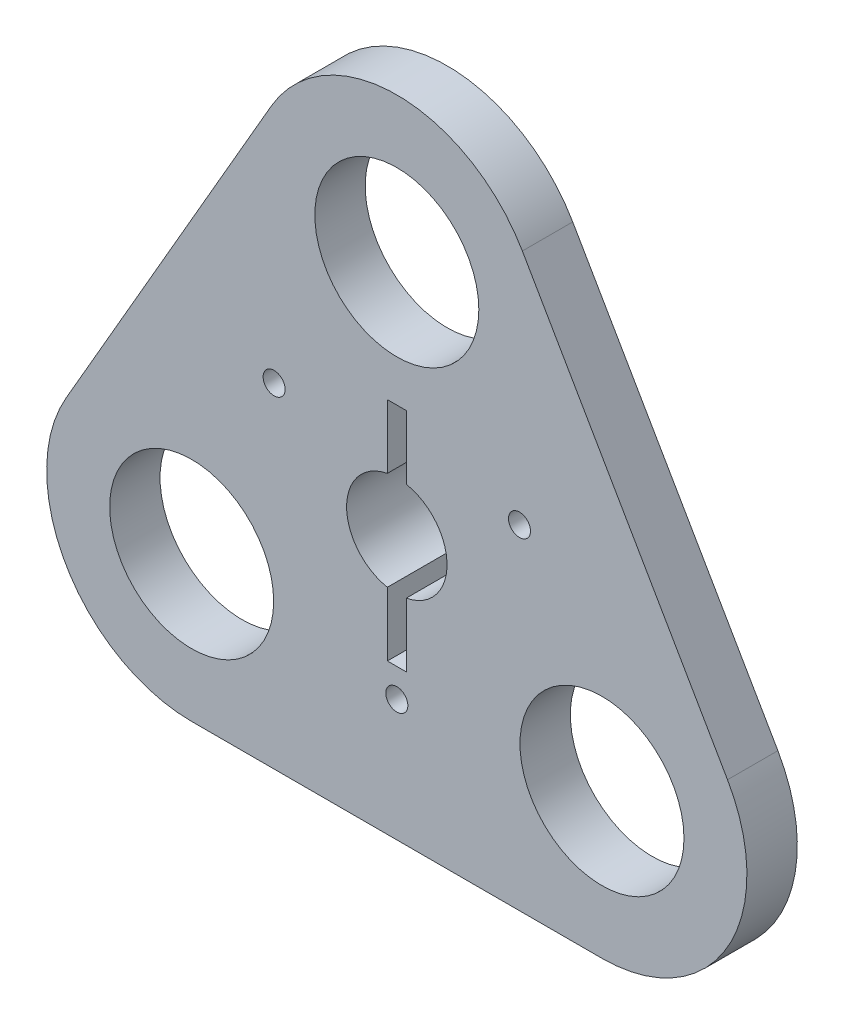
ISO-10303-21;
HEADER;
FILE_DESCRIPTION(('STEP AP214'),'2;1');
FILE_NAME('part.step','',(''),(''),'','','');
FILE_SCHEMA(('AUTOMOTIVE_DESIGN { 1 0 10303 214 1 1 1 1 }'));
ENDSEC;
DATA;
#1=APPLICATION_CONTEXT('core data for automotive mechanical design processes');
#2=APPLICATION_PROTOCOL_DEFINITION('international standard','automotive_design',2000,#1);
#3=PRODUCT_CONTEXT('',#1,'mechanical');
#4=PRODUCT('Part','Part','',(#3));
#5=PRODUCT_RELATED_PRODUCT_CATEGORY('part','',(#4));
#6=PRODUCT_DEFINITION_FORMATION('','',#4);
#7=PRODUCT_DEFINITION_CONTEXT('part definition',#1,'design');
#8=PRODUCT_DEFINITION('design','',#6,#7);
#9=PRODUCT_DEFINITION_SHAPE('','',#8);
#10=(LENGTH_UNIT() NAMED_UNIT(*) SI_UNIT(.MILLI.,.METRE.));
#11=(NAMED_UNIT(*) PLANE_ANGLE_UNIT() SI_UNIT($,.RADIAN.));
#12=(NAMED_UNIT(*) SI_UNIT($,.STERADIAN.) SOLID_ANGLE_UNIT());
#13=UNCERTAINTY_MEASURE_WITH_UNIT(LENGTH_MEASURE(1.E-05),#10,'distance_accuracy_value','');
#14=(GEOMETRIC_REPRESENTATION_CONTEXT(3) GLOBAL_UNCERTAINTY_ASSIGNED_CONTEXT((#13)) GLOBAL_UNIT_ASSIGNED_CONTEXT((#10,
#11,#12)) REPRESENTATION_CONTEXT('',''));
#15=CARTESIAN_POINT('',(0.,0.,0.));
#16=DIRECTION('',(0.,0.,1.));
#17=DIRECTION('',(1.,0.,0.));
#18=AXIS2_PLACEMENT_3D('',#15,#16,#17);
#19=CARTESIAN_POINT('',(0.,0.,4.));
#20=DIRECTION('',(0.,0.,-1.));
#21=DIRECTION('',(-1.,0.,0.));
#22=AXIS2_PLACEMENT_3D('',#19,#20,#21);
#23=CYLINDRICAL_SURFACE('',#22,7.975);
#24=CARTESIAN_POINT('',(0.,0.,4.));
#25=DIRECTION('',(0.,0.,1.));
#26=DIRECTION('',(1.,0.,0.));
#27=AXIS2_PLACEMENT_3D('',#24,#25,#26);
#28=CIRCLE('',#27,7.975);
#29=CARTESIAN_POINT('',(-1.5,7.83266397849416,4.));
#30=VERTEX_POINT('',#29);
#31=CARTESIAN_POINT('',(-1.5,-7.83266397849416,4.));
#32=VERTEX_POINT('',#31);
#33=EDGE_CURVE('E359',#30,#32,#28,.T.);
#34=ORIENTED_EDGE('',*,*,#33,.T.);
#35=DIRECTION('',(0.,0.,1.));
#36=VECTOR('',#35,1.);
#37=CARTESIAN_POINT('',(-1.5,-7.83266397849416,-8.));
#38=LINE('',#37,#36);
#39=CARTESIAN_POINT('',(-1.5,-7.83266397849416,-8.));
#40=VERTEX_POINT('',#39);
#41=EDGE_CURVE('E242',#40,#32,#38,.T.);
#42=ORIENTED_EDGE('',*,*,#41,.F.);
#43=CARTESIAN_POINT('',(0.,0.,-8.));
#44=DIRECTION('',(0.,0.,-1.));
#45=DIRECTION('',(-1.,0.,0.));
#46=AXIS2_PLACEMENT_3D('',#43,#44,#45);
#47=CIRCLE('',#46,7.975);
#48=CARTESIAN_POINT('',(-1.5,7.83266397849416,-8.));
#49=VERTEX_POINT('',#48);
#50=EDGE_CURVE('E226',#40,#49,#47,.T.);
#51=ORIENTED_EDGE('',*,*,#50,.T.);
#52=DIRECTION('',(0.,0.,1.));
#53=VECTOR('',#52,1.);
#54=CARTESIAN_POINT('',(-1.5,7.83266397849416,-8.));
#55=LINE('',#54,#53);
#56=EDGE_CURVE('E302',#49,#30,#55,.T.);
#57=ORIENTED_EDGE('',*,*,#56,.T.);
#58=EDGE_LOOP('',(#34,#42,#51,#57));
#59=FACE_BOUND('',#58,.T.);
#60=ADVANCED_FACE('F64',(#59),#23,.F.);
#61=CARTESIAN_POINT('',(1.5,7.83266397849416,-8.));
#62=VERTEX_POINT('',#61);
#63=CARTESIAN_POINT('',(1.5,-7.83266397849416,-8.));
#64=VERTEX_POINT('',#63);
#65=EDGE_CURVE('E310',#62,#64,#47,.T.);
#66=ORIENTED_EDGE('',*,*,#65,.T.);
#67=DIRECTION('',(0.,0.,1.));
#68=VECTOR('',#67,1.);
#69=CARTESIAN_POINT('',(1.5,-7.83266397849416,-8.));
#70=LINE('',#69,#68);
#71=CARTESIAN_POINT('',(1.5,-7.83266397849416,4.));
#72=VERTEX_POINT('',#71);
#73=EDGE_CURVE('E246',#64,#72,#70,.T.);
#74=ORIENTED_EDGE('',*,*,#73,.T.);
#75=CARTESIAN_POINT('',(1.5,7.83266397849416,4.));
#76=VERTEX_POINT('',#75);
#77=EDGE_CURVE('E358',#72,#76,#28,.T.);
#78=ORIENTED_EDGE('',*,*,#77,.T.);
#79=DIRECTION('',(0.,0.,1.));
#80=VECTOR('',#79,1.);
#81=CARTESIAN_POINT('',(1.5,7.83266397849416,-8.));
#82=LINE('',#81,#80);
#83=EDGE_CURVE('E297',#62,#76,#82,.T.);
#84=ORIENTED_EDGE('',*,*,#83,.F.);
#85=EDGE_LOOP('',(#66,#74,#78,#84));
#86=FACE_BOUND('',#85,.T.);
#87=ADVANCED_FACE('F487',(#86),#23,.F.);
#88=CARTESIAN_POINT('',(0.,0.,4.));
#89=DIRECTION('',(0.,0.,1.));
#90=DIRECTION('',(1.,0.,0.));
#91=AXIS2_PLACEMENT_3D('',#88,#89,#90);
#92=PLANE('',#91);
#93=CARTESIAN_POINT('',(19.4855715851499,11.25,4.));
#94=DIRECTION('',(0.,0.,1.));
#95=DIRECTION('',(-0.500000000000004,-0.866025403784436,0.));
#96=AXIS2_PLACEMENT_3D('',#93,#94,#95);
#97=CIRCLE('',#96,1.75);
#98=CARTESIAN_POINT('',(18.6105715851499,9.7344555433772,4.));
#99=VERTEX_POINT('',#98);
#100=EDGE_CURVE('E257',#99,#99,#97,.T.);
#101=ORIENTED_EDGE('',*,*,#100,.F.);
#102=EDGE_LOOP('',(#101));
#103=FACE_BOUND('',#102,.T.);
#104=CARTESIAN_POINT('',(-1.49186218934005E-13,-22.5,4.));
#105=DIRECTION('',(0.,0.,1.));
#106=DIRECTION('',(-0.499999999999992,0.866025403784443,0.));
#107=AXIS2_PLACEMENT_3D('',#104,#105,#106);
#108=CIRCLE('',#107,1.75);
#109=CARTESIAN_POINT('',(-0.875000000000135,-20.9844555433772,4.));
#110=VERTEX_POINT('',#109);
#111=EDGE_CURVE('E245',#110,#110,#108,.T.);
#112=ORIENTED_EDGE('',*,*,#111,.F.);
#113=EDGE_LOOP('',(#112));
#114=FACE_BOUND('',#113,.T.);
#115=CARTESIAN_POINT('',(-19.4855715851499,11.2499999999999,4.));
#116=DIRECTION('',(0.,0.,1.));
#117=DIRECTION('',(1.,0.,0.));
#118=AXIS2_PLACEMENT_3D('',#115,#116,#117);
#119=CIRCLE('',#118,1.75);
#120=CARTESIAN_POINT('',(-17.7355715851499,11.2499999999999,4.));
#121=VERTEX_POINT('',#120);
#122=EDGE_CURVE('E256',#121,#121,#119,.T.);
#123=ORIENTED_EDGE('',*,*,#122,.F.);
#124=EDGE_LOOP('',(#123));
#125=FACE_BOUND('',#124,.T.);
#126=CARTESIAN_POINT('',(0.,37.625,4.));
#127=DIRECTION('',(0.,0.,1.));
#128=DIRECTION('',(1.,0.,0.));
#129=AXIS2_PLACEMENT_3D('',#126,#127,#128);
#130=CIRCLE('',#129,13.025);
#131=CARTESIAN_POINT('',(13.025,37.625,4.));
#132=VERTEX_POINT('',#131);
#133=EDGE_CURVE('E334',#132,#132,#130,.T.);
#134=ORIENTED_EDGE('',*,*,#133,.F.);
#135=EDGE_LOOP('',(#134));
#136=FACE_BOUND('',#135,.T.);
#137=CARTESIAN_POINT('',(0.,37.625,4.));
#138=DIRECTION('',(0.,0.,1.));
#139=DIRECTION('',(1.,0.,0.));
#140=AXIS2_PLACEMENT_3D('',#137,#138,#139);
#141=CIRCLE('',#140,23.025);
#142=CARTESIAN_POINT('',(19.9402349221367,49.1375,4.));
#143=VERTEX_POINT('',#142);
#144=CARTESIAN_POINT('',(-19.9402349221367,49.1375,4.));
#145=VERTEX_POINT('',#144);
#146=EDGE_CURVE('E338',#143,#145,#141,.T.);
#147=ORIENTED_EDGE('',*,*,#146,.T.);
#148=DIRECTION('',(-0.499999999999998,-0.86602540378444,0.));
#149=VECTOR('',#148,1.);
#150=CARTESIAN_POINT('',(-36.2323378308314,20.9187499999999,4.));
#151=LINE('',#150,#149);
#152=CARTESIAN_POINT('',(-52.5244407395261,-7.30000000000021,4.));
#153=VERTEX_POINT('',#152);
#154=EDGE_CURVE('E343',#145,#153,#151,.T.);
#155=ORIENTED_EDGE('',*,*,#154,.T.);
#156=CARTESIAN_POINT('',(-32.5842058173894,-18.8125000000002,4.));
#157=DIRECTION('',(0.,0.,1.));
#158=DIRECTION('',(1.,0.,0.));
#159=AXIS2_PLACEMENT_3D('',#156,#157,#158);
#160=CIRCLE('',#159,23.025);
#161=CARTESIAN_POINT('',(-32.5842058173894,-41.8375000000002,4.));
#162=VERTEX_POINT('',#161);
#163=EDGE_CURVE('E346',#153,#162,#160,.T.);
#164=ORIENTED_EDGE('',*,*,#163,.T.);
#165=DIRECTION('',(1.,0.,0.));
#166=VECTOR('',#165,1.);
#167=CARTESIAN_POINT('',(0.,-41.8375000000002,4.));
#168=LINE('',#167,#166);
#169=CARTESIAN_POINT('',(32.5842058173894,-41.8375000000002,4.));
#170=VERTEX_POINT('',#169);
#171=EDGE_CURVE('E349',#162,#170,#168,.T.);
#172=ORIENTED_EDGE('',*,*,#171,.T.);
#173=CARTESIAN_POINT('',(32.5842058173894,-18.8125000000002,4.));
#174=DIRECTION('',(0.,0.,1.));
#175=DIRECTION('',(1.,0.,0.));
#176=AXIS2_PLACEMENT_3D('',#173,#174,#175);
#177=CIRCLE('',#176,23.025);
#178=CARTESIAN_POINT('',(52.5244407395262,-7.3000000000002,4.));
#179=VERTEX_POINT('',#178);
#180=EDGE_CURVE('E352',#170,#179,#177,.T.);
#181=ORIENTED_EDGE('',*,*,#180,.T.);
#182=DIRECTION('',(-0.499999999999998,0.86602540378444,0.));
#183=VECTOR('',#182,1.);
#184=CARTESIAN_POINT('',(36.2323378308314,20.9187499999999,4.));
#185=LINE('',#184,#183);
#186=EDGE_CURVE('E355',#179,#143,#185,.T.);
#187=ORIENTED_EDGE('',*,*,#186,.T.);
#188=EDGE_LOOP('',(#147,#155,#164,#172,#181,#187));
#189=FACE_BOUND('',#188,.T.);
#190=CARTESIAN_POINT('',(32.5842058173894,-18.8125000000002,4.));
#191=DIRECTION('',(0.,0.,1.));
#192=DIRECTION('',(1.,0.,0.));
#193=AXIS2_PLACEMENT_3D('',#190,#191,#192);
#194=CIRCLE('',#193,13.025);
#195=CARTESIAN_POINT('',(45.6092058173894,-18.8125000000002,4.));
#196=VERTEX_POINT('',#195);
#197=EDGE_CURVE('E363',#196,#196,#194,.T.);
#198=ORIENTED_EDGE('',*,*,#197,.F.);
#199=EDGE_LOOP('',(#198));
#200=FACE_BOUND('',#199,.T.);
#201=CARTESIAN_POINT('',(-32.5842058173894,-18.8125000000002,4.));
#202=DIRECTION('',(0.,0.,1.));
#203=DIRECTION('',(1.,0.,0.));
#204=AXIS2_PLACEMENT_3D('',#201,#202,#203);
#205=CIRCLE('',#204,13.025);
#206=CARTESIAN_POINT('',(-19.5592058173894,-18.8125000000002,4.));
#207=VERTEX_POINT('',#206);
#208=EDGE_CURVE('E367',#207,#207,#205,.T.);
#209=ORIENTED_EDGE('',*,*,#208,.F.);
#210=EDGE_LOOP('',(#209));
#211=FACE_BOUND('',#210,.T.);
#212=DIRECTION('',(-1.,0.,0.));
#213=VECTOR('',#212,1.);
#214=CARTESIAN_POINT('',(0.,-17.975,4.));
#215=LINE('',#214,#213);
#216=CARTESIAN_POINT('',(1.5,-17.975,4.));
#217=VERTEX_POINT('',#216);
#218=CARTESIAN_POINT('',(-1.5,-17.975,4.));
#219=VERTEX_POINT('',#218);
#220=EDGE_CURVE('E233',#217,#219,#215,.T.);
#221=ORIENTED_EDGE('',*,*,#220,.T.);
#222=DIRECTION('',(0.,1.,0.));
#223=VECTOR('',#222,1.);
#224=CARTESIAN_POINT('',(-1.5,0.,4.));
#225=LINE('',#224,#223);
#226=EDGE_CURVE('E219',#219,#32,#225,.T.);
#227=ORIENTED_EDGE('',*,*,#226,.T.);
#228=ORIENTED_EDGE('',*,*,#33,.F.);
#229=DIRECTION('',(0.,1.,0.));
#230=VECTOR('',#229,1.);
#231=CARTESIAN_POINT('',(-1.5,0.,4.));
#232=LINE('',#231,#230);
#233=CARTESIAN_POINT('',(-1.5,17.975,4.));
#234=VERTEX_POINT('',#233);
#235=EDGE_CURVE('E280',#30,#234,#232,.T.);
#236=ORIENTED_EDGE('',*,*,#235,.T.);
#237=DIRECTION('',(1.,0.,0.));
#238=VECTOR('',#237,1.);
#239=CARTESIAN_POINT('',(0.,17.975,4.));
#240=LINE('',#239,#238);
#241=CARTESIAN_POINT('',(1.5,17.975,4.));
#242=VERTEX_POINT('',#241);
#243=EDGE_CURVE('E290',#234,#242,#240,.T.);
#244=ORIENTED_EDGE('',*,*,#243,.T.);
#245=DIRECTION('',(0.,-1.,0.));
#246=VECTOR('',#245,1.);
#247=CARTESIAN_POINT('',(1.5,0.,4.));
#248=LINE('',#247,#246);
#249=EDGE_CURVE('E272',#242,#76,#248,.T.);
#250=ORIENTED_EDGE('',*,*,#249,.T.);
#251=ORIENTED_EDGE('',*,*,#77,.F.);
#252=DIRECTION('',(0.,-1.,0.));
#253=VECTOR('',#252,1.);
#254=CARTESIAN_POINT('',(1.5,0.,4.));
#255=LINE('',#254,#253);
#256=EDGE_CURVE('E228',#72,#217,#255,.T.);
#257=ORIENTED_EDGE('',*,*,#256,.T.);
#258=EDGE_LOOP('',(#221,#227,#228,#236,#244,#250,#251,#257));
#259=FACE_BOUND('',#258,.T.);
#260=ADVANCED_FACE('F483',(#103,#114,#125,#136,#189,#200,#211,#259),#92,.T.);
#261=CARTESIAN_POINT('',(19.4855715851499,11.25,-8.));
#262=DIRECTION('',(0.,0.,-1.));
#263=DIRECTION('',(-1.,0.,0.));
#264=AXIS2_PLACEMENT_3D('',#261,#262,#263);
#265=PLANE('',#264);
#266=CARTESIAN_POINT('',(19.4855715851499,11.25,-8.));
#267=DIRECTION('',(0.,0.,1.));
#268=DIRECTION('',(-0.500000000000004,-0.866025403784436,0.));
#269=AXIS2_PLACEMENT_3D('',#266,#267,#268);
#270=CIRCLE('',#269,1.75);
#271=CARTESIAN_POINT('',(18.6105715851499,9.7344555433772,-8.));
#272=VERTEX_POINT('',#271);
#273=EDGE_CURVE('E252',#272,#272,#270,.T.);
#274=ORIENTED_EDGE('',*,*,#273,.T.);
#275=EDGE_LOOP('',(#274));
#276=FACE_BOUND('',#275,.T.);
#277=CARTESIAN_POINT('',(-1.49186218934005E-13,-22.5,-8.));
#278=DIRECTION('',(0.,0.,1.));
#279=DIRECTION('',(-0.499999999999992,0.866025403784443,0.));
#280=AXIS2_PLACEMENT_3D('',#277,#278,#279);
#281=CIRCLE('',#280,1.75);
#282=CARTESIAN_POINT('',(-0.875000000000135,-20.9844555433772,-8.));
#283=VERTEX_POINT('',#282);
#284=EDGE_CURVE('E261',#283,#283,#281,.T.);
#285=ORIENTED_EDGE('',*,*,#284,.T.);
#286=EDGE_LOOP('',(#285));
#287=FACE_BOUND('',#286,.T.);
#288=CARTESIAN_POINT('',(-19.4855715851499,11.2499999999999,-8.));
#289=DIRECTION('',(0.,0.,1.));
#290=DIRECTION('',(1.,0.,0.));
#291=AXIS2_PLACEMENT_3D('',#288,#289,#290);
#292=CIRCLE('',#291,1.75);
#293=CARTESIAN_POINT('',(-17.7355715851499,11.2499999999999,-8.));
#294=VERTEX_POINT('',#293);
#295=EDGE_CURVE('E268',#294,#294,#292,.T.);
#296=ORIENTED_EDGE('',*,*,#295,.T.);
#297=EDGE_LOOP('',(#296));
#298=FACE_BOUND('',#297,.T.);
#299=CARTESIAN_POINT('',(19.4855715851499,11.25,-8.));
#300=DIRECTION('',(0.,0.,-1.));
#301=DIRECTION('',(-1.,0.,0.));
#302=AXIS2_PLACEMENT_3D('',#299,#300,#301);
#303=CIRCLE('',#302,6.75);
#304=CARTESIAN_POINT('',(19.4855715851499,18.,-8.));
#305=VERTEX_POINT('',#304);
#306=CARTESIAN_POINT('',(25.3312430606948,7.87499999999999,-8.));
#307=VERTEX_POINT('',#306);
#308=EDGE_CURVE('E314',#305,#307,#303,.T.);
#309=ORIENTED_EDGE('',*,*,#308,.T.);
#310=DIRECTION('',(-0.5,-0.866025403784439,0.));
#311=VECTOR('',#310,1.);
#312=CARTESIAN_POINT('',(5.84567147554496,-25.875,-8.));
#313=LINE('',#312,#311);
#314=CARTESIAN_POINT('',(5.84567147554496,-25.875,-8.));
#315=VERTEX_POINT('',#314);
#316=EDGE_CURVE('E317',#307,#315,#313,.T.);
#317=ORIENTED_EDGE('',*,*,#316,.T.);
#318=CARTESIAN_POINT('',(0.,-22.5,-8.));
#319=DIRECTION('',(0.,0.,-1.));
#320=DIRECTION('',(-1.,0.,0.));
#321=AXIS2_PLACEMENT_3D('',#318,#319,#320);
#322=CIRCLE('',#321,6.75);
#323=CARTESIAN_POINT('',(-5.84567147554496,-25.875,-8.));
#324=VERTEX_POINT('',#323);
#325=EDGE_CURVE('E320',#315,#324,#322,.T.);
#326=ORIENTED_EDGE('',*,*,#325,.T.);
#327=DIRECTION('',(-0.5,0.866025403784438,0.));
#328=VECTOR('',#327,1.);
#329=CARTESIAN_POINT('',(-25.3312430606948,7.87499999999999,-8.));
#330=LINE('',#329,#328);
#331=CARTESIAN_POINT('',(-25.3312430606948,7.87499999999999,-8.));
#332=VERTEX_POINT('',#331);
#333=EDGE_CURVE('E324',#324,#332,#330,.T.);
#334=ORIENTED_EDGE('',*,*,#333,.T.);
#335=CARTESIAN_POINT('',(-19.4855715851499,11.25,-8.));
#336=DIRECTION('',(0.,0.,-1.));
#337=DIRECTION('',(-1.,0.,0.));
#338=AXIS2_PLACEMENT_3D('',#335,#336,#337);
#339=CIRCLE('',#338,6.75);
#340=CARTESIAN_POINT('',(-19.4855715851499,18.,-8.));
#341=VERTEX_POINT('',#340);
#342=EDGE_CURVE('E327',#332,#341,#339,.T.);
#343=ORIENTED_EDGE('',*,*,#342,.T.);
#344=DIRECTION('',(1.,0.,0.));
#345=VECTOR('',#344,1.);
#346=CARTESIAN_POINT('',(19.4855715851499,18.,-8.));
#347=LINE('',#346,#345);
#348=EDGE_CURVE('E330',#341,#305,#347,.T.);
#349=ORIENTED_EDGE('',*,*,#348,.T.);
#350=EDGE_LOOP('',(#309,#317,#326,#334,#343,#349));
#351=FACE_BOUND('',#350,.T.);
#352=ORIENTED_EDGE('',*,*,#50,.F.);
#353=DIRECTION('',(0.,1.,0.));
#354=VECTOR('',#353,1.);
#355=CARTESIAN_POINT('',(-1.5,0.,-8.));
#356=LINE('',#355,#354);
#357=CARTESIAN_POINT('',(-1.5,-17.975,-8.));
#358=VERTEX_POINT('',#357);
#359=EDGE_CURVE('E213',#358,#40,#356,.T.);
#360=ORIENTED_EDGE('',*,*,#359,.F.);
#361=DIRECTION('',(-1.,0.,0.));
#362=VECTOR('',#361,1.);
#363=CARTESIAN_POINT('',(0.,-17.975,-8.));
#364=LINE('',#363,#362);
#365=CARTESIAN_POINT('',(1.5,-17.975,-8.));
#366=VERTEX_POINT('',#365);
#367=EDGE_CURVE('E203',#366,#358,#364,.T.);
#368=ORIENTED_EDGE('',*,*,#367,.F.);
#369=DIRECTION('',(0.,-1.,0.));
#370=VECTOR('',#369,1.);
#371=CARTESIAN_POINT('',(1.5,0.,-8.));
#372=LINE('',#371,#370);
#373=EDGE_CURVE('E212',#64,#366,#372,.T.);
#374=ORIENTED_EDGE('',*,*,#373,.F.);
#375=ORIENTED_EDGE('',*,*,#65,.F.);
#376=DIRECTION('',(0.,-1.,0.));
#377=VECTOR('',#376,1.);
#378=CARTESIAN_POINT('',(1.5,0.,-8.));
#379=LINE('',#378,#377);
#380=CARTESIAN_POINT('',(1.5,17.975,-8.));
#381=VERTEX_POINT('',#380);
#382=EDGE_CURVE('E276',#381,#62,#379,.T.);
#383=ORIENTED_EDGE('',*,*,#382,.F.);
#384=DIRECTION('',(1.,0.,0.));
#385=VECTOR('',#384,1.);
#386=CARTESIAN_POINT('',(0.,17.975,-8.));
#387=LINE('',#386,#385);
#388=CARTESIAN_POINT('',(-1.5,17.975,-8.));
#389=VERTEX_POINT('',#388);
#390=EDGE_CURVE('E279',#389,#381,#387,.T.);
#391=ORIENTED_EDGE('',*,*,#390,.F.);
#392=DIRECTION('',(0.,1.,0.));
#393=VECTOR('',#392,1.);
#394=CARTESIAN_POINT('',(-1.5,0.,-8.));
#395=LINE('',#394,#393);
#396=EDGE_CURVE('E283',#49,#389,#395,.T.);
#397=ORIENTED_EDGE('',*,*,#396,.F.);
#398=EDGE_LOOP('',(#352,#360,#368,#374,#375,#383,#391,#397));
#399=FACE_BOUND('',#398,.T.);
#400=ADVANCED_FACE('F224',(#276,#287,#298,#351,#399),#265,.T.);
#401=CARTESIAN_POINT('',(0.,0.,-4.));
#402=DIRECTION('',(0.,0.,1.));
#403=DIRECTION('',(1.,0.,0.));
#404=AXIS2_PLACEMENT_3D('',#401,#402,#403);
#405=PLANE('',#404);
#406=DIRECTION('',(0.5,-0.866025403784439,0.));
#407=VECTOR('',#406,1.);
#408=CARTESIAN_POINT('',(-9.3097730906827,-27.875,-4.));
#409=LINE('',#408,#407);
#410=CARTESIAN_POINT('',(-28.7953446758326,5.87499999999999,-4.));
#411=VERTEX_POINT('',#410);
#412=CARTESIAN_POINT('',(-9.3097730906827,-27.875,-4.));
#413=VERTEX_POINT('',#412);
#414=EDGE_CURVE('E75',#411,#413,#409,.T.);
#415=ORIENTED_EDGE('',*,*,#414,.T.);
#416=CARTESIAN_POINT('',(0.,-22.5,-4.));
#417=DIRECTION('',(0.,0.,1.));
#418=DIRECTION('',(1.,0.,0.));
#419=AXIS2_PLACEMENT_3D('',#416,#417,#418);
#420=CIRCLE('',#419,10.75);
#421=CARTESIAN_POINT('',(9.30977309068271,-27.875,-4.));
#422=VERTEX_POINT('',#421);
#423=EDGE_CURVE('E13',#413,#422,#420,.T.);
#424=ORIENTED_EDGE('',*,*,#423,.T.);
#425=DIRECTION('',(0.5,0.866025403784439,0.));
#426=VECTOR('',#425,1.);
#427=CARTESIAN_POINT('',(28.7953446758326,5.875,-4.));
#428=LINE('',#427,#426);
#429=CARTESIAN_POINT('',(28.7953446758326,5.875,-4.));
#430=VERTEX_POINT('',#429);
#431=EDGE_CURVE('E433',#422,#430,#428,.T.);
#432=ORIENTED_EDGE('',*,*,#431,.T.);
#433=CARTESIAN_POINT('',(19.4855715851499,11.25,-4.));
#434=DIRECTION('',(0.,0.,1.));
#435=DIRECTION('',(1.,0.,0.));
#436=AXIS2_PLACEMENT_3D('',#433,#434,#435);
#437=CIRCLE('',#436,10.75);
#438=CARTESIAN_POINT('',(19.4855715851499,22.,-4.));
#439=VERTEX_POINT('',#438);
#440=EDGE_CURVE('E427',#430,#439,#437,.T.);
#441=ORIENTED_EDGE('',*,*,#440,.T.);
#442=DIRECTION('',(-1.,0.,0.));
#443=VECTOR('',#442,1.);
#444=CARTESIAN_POINT('',(-19.4855715851499,22.,-4.));
#445=LINE('',#444,#443);
#446=CARTESIAN_POINT('',(-19.4855715851499,22.,-4.));
#447=VERTEX_POINT('',#446);
#448=EDGE_CURVE('E424',#439,#447,#445,.T.);
#449=ORIENTED_EDGE('',*,*,#448,.T.);
#450=CARTESIAN_POINT('',(-19.4855715851499,11.25,-4.));
#451=DIRECTION('',(0.,0.,1.));
#452=DIRECTION('',(1.,0.,0.));
#453=AXIS2_PLACEMENT_3D('',#450,#451,#452);
#454=CIRCLE('',#453,10.75);
#455=EDGE_CURVE('E430',#447,#411,#454,.T.);
#456=ORIENTED_EDGE('',*,*,#455,.T.);
#457=EDGE_LOOP('',(#415,#424,#432,#441,#449,#456));
#458=FACE_BOUND('',#457,.T.);
#459=CARTESIAN_POINT('',(-32.5842058173894,-18.8125000000002,-4.));
#460=DIRECTION('',(0.,0.,1.));
#461=DIRECTION('',(1.,0.,0.));
#462=AXIS2_PLACEMENT_3D('',#459,#460,#461);
#463=CIRCLE('',#462,13.025);
#464=CARTESIAN_POINT('',(-19.5592058173894,-18.8125000000002,-4.));
#465=VERTEX_POINT('',#464);
#466=EDGE_CURVE('E339',#465,#465,#463,.T.);
#467=ORIENTED_EDGE('',*,*,#466,.T.);
#468=EDGE_LOOP('',(#467));
#469=FACE_BOUND('',#468,.T.);
#470=CARTESIAN_POINT('',(32.5842058173894,-18.8125000000002,-4.));
#471=DIRECTION('',(0.,0.,1.));
#472=DIRECTION('',(1.,0.,0.));
#473=AXIS2_PLACEMENT_3D('',#470,#471,#472);
#474=CIRCLE('',#473,13.025);
#475=CARTESIAN_POINT('',(45.6092058173894,-18.8125000000002,-4.));
#476=VERTEX_POINT('',#475);
#477=EDGE_CURVE('E394',#476,#476,#474,.T.);
#478=ORIENTED_EDGE('',*,*,#477,.T.);
#479=EDGE_LOOP('',(#478));
#480=FACE_BOUND('',#479,.T.);
#481=CARTESIAN_POINT('',(0.,37.625,-4.));
#482=DIRECTION('',(0.,0.,1.));
#483=DIRECTION('',(1.,0.,0.));
#484=AXIS2_PLACEMENT_3D('',#481,#482,#483);
#485=CIRCLE('',#484,23.025);
#486=CARTESIAN_POINT('',(19.9402349221367,49.1375,-4.));
#487=VERTEX_POINT('',#486);
#488=CARTESIAN_POINT('',(-19.9402349221367,49.1375,-4.));
#489=VERTEX_POINT('',#488);
#490=EDGE_CURVE('E375',#487,#489,#485,.T.);
#491=ORIENTED_EDGE('',*,*,#490,.F.);
#492=DIRECTION('',(-0.499999999999998,0.86602540378444,0.));
#493=VECTOR('',#492,1.);
#494=CARTESIAN_POINT('',(36.2323378308314,20.9187499999999,-4.));
#495=LINE('',#494,#493);
#496=CARTESIAN_POINT('',(52.5244407395262,-7.3000000000002,-4.));
#497=VERTEX_POINT('',#496);
#498=EDGE_CURVE('E391',#497,#487,#495,.T.);
#499=ORIENTED_EDGE('',*,*,#498,.F.);
#500=CARTESIAN_POINT('',(32.5842058173894,-18.8125000000002,-4.));
#501=DIRECTION('',(0.,0.,1.));
#502=DIRECTION('',(1.,0.,0.));
#503=AXIS2_PLACEMENT_3D('',#500,#501,#502);
#504=CIRCLE('',#503,23.025);
#505=CARTESIAN_POINT('',(32.5842058173894,-41.8375000000002,-4.));
#506=VERTEX_POINT('',#505);
#507=EDGE_CURVE('E388',#506,#497,#504,.T.);
#508=ORIENTED_EDGE('',*,*,#507,.F.);
#509=DIRECTION('',(1.,0.,0.));
#510=VECTOR('',#509,1.);
#511=CARTESIAN_POINT('',(0.,-41.8375000000002,-4.));
#512=LINE('',#511,#510);
#513=CARTESIAN_POINT('',(-32.5842058173894,-41.8375000000002,-4.));
#514=VERTEX_POINT('',#513);
#515=EDGE_CURVE('E385',#514,#506,#512,.T.);
#516=ORIENTED_EDGE('',*,*,#515,.F.);
#517=CARTESIAN_POINT('',(-32.5842058173894,-18.8125000000002,-4.));
#518=DIRECTION('',(0.,0.,1.));
#519=DIRECTION('',(1.,0.,0.));
#520=AXIS2_PLACEMENT_3D('',#517,#518,#519);
#521=CIRCLE('',#520,23.025);
#522=CARTESIAN_POINT('',(-52.5244407395261,-7.30000000000021,-4.));
#523=VERTEX_POINT('',#522);
#524=EDGE_CURVE('E382',#523,#514,#521,.T.);
#525=ORIENTED_EDGE('',*,*,#524,.F.);
#526=DIRECTION('',(-0.499999999999998,-0.86602540378444,0.));
#527=VECTOR('',#526,1.);
#528=CARTESIAN_POINT('',(-36.2323378308314,20.9187499999999,-4.));
#529=LINE('',#528,#527);
#530=EDGE_CURVE('E379',#489,#523,#529,.T.);
#531=ORIENTED_EDGE('',*,*,#530,.F.);
#532=EDGE_LOOP('',(#491,#499,#508,#516,#525,#531));
#533=FACE_BOUND('',#532,.T.);
#534=CARTESIAN_POINT('',(0.,37.625,-4.));
#535=DIRECTION('',(0.,0.,1.));
#536=DIRECTION('',(1.,0.,0.));
#537=AXIS2_PLACEMENT_3D('',#534,#535,#536);
#538=CIRCLE('',#537,13.025);
#539=CARTESIAN_POINT('',(13.025,37.625,-4.));
#540=VERTEX_POINT('',#539);
#541=EDGE_CURVE('E333',#540,#540,#538,.T.);
#542=ORIENTED_EDGE('',*,*,#541,.T.);
#543=EDGE_LOOP('',(#542));
#544=FACE_BOUND('',#543,.T.);
#545=ADVANCED_FACE('F665',(#458,#469,#480,#533,#544),#405,.F.);
#546=CARTESIAN_POINT('',(0.,37.625,4.));
#547=DIRECTION('',(0.,0.,-1.));
#548=DIRECTION('',(-1.,0.,0.));
#549=AXIS2_PLACEMENT_3D('',#546,#547,#548);
#550=CYLINDRICAL_SURFACE('',#549,23.025);
#551=ORIENTED_EDGE('',*,*,#490,.T.);
#552=DIRECTION('',(0.,0.,-1.));
#553=VECTOR('',#552,1.);
#554=CARTESIAN_POINT('',(-19.9402349221367,49.1375,4.));
#555=LINE('',#554,#553);
#556=EDGE_CURVE('E420',#145,#489,#555,.T.);
#557=ORIENTED_EDGE('',*,*,#556,.F.);
#558=ORIENTED_EDGE('',*,*,#146,.F.);
#559=DIRECTION('',(0.,0.,-1.));
#560=VECTOR('',#559,1.);
#561=CARTESIAN_POINT('',(19.9402349221367,49.1375,4.));
#562=LINE('',#561,#560);
#563=EDGE_CURVE('E371',#143,#487,#562,.T.);
#564=ORIENTED_EDGE('',*,*,#563,.T.);
#565=EDGE_LOOP('',(#551,#557,#558,#564));
#566=FACE_BOUND('',#565,.T.);
#567=ADVANCED_FACE('F661',(#566),#550,.T.);
#568=CARTESIAN_POINT('',(-36.2323378308314,20.9187499999999,4.));
#569=DIRECTION('',(0.86602540378444,-0.499999999999998,0.));
#570=DIRECTION('',(0.499999999999998,0.86602540378444,0.));
#571=AXIS2_PLACEMENT_3D('',#568,#569,#570);
#572=PLANE('',#571);
#573=ORIENTED_EDGE('',*,*,#530,.T.);
#574=DIRECTION('',(0.,0.,-1.));
#575=VECTOR('',#574,1.);
#576=CARTESIAN_POINT('',(-52.5244407395261,-7.30000000000021,4.));
#577=LINE('',#576,#575);
#578=EDGE_CURVE('E416',#153,#523,#577,.T.);
#579=ORIENTED_EDGE('',*,*,#578,.F.);
#580=ORIENTED_EDGE('',*,*,#154,.F.);
#581=ORIENTED_EDGE('',*,*,#556,.T.);
#582=EDGE_LOOP('',(#573,#579,#580,#581));
#583=FACE_BOUND('',#582,.T.);
#584=ADVANCED_FACE('F657',(#583),#572,.F.);
#585=CARTESIAN_POINT('',(-32.5842058173894,-18.8125000000002,4.));
#586=DIRECTION('',(0.,0.,-1.));
#587=DIRECTION('',(-1.,0.,0.));
#588=AXIS2_PLACEMENT_3D('',#585,#586,#587);
#589=CYLINDRICAL_SURFACE('',#588,23.025);
#590=ORIENTED_EDGE('',*,*,#524,.T.);
#591=DIRECTION('',(0.,0.,-1.));
#592=VECTOR('',#591,1.);
#593=CARTESIAN_POINT('',(-32.5842058173894,-41.8375000000002,4.));
#594=LINE('',#593,#592);
#595=EDGE_CURVE('E412',#162,#514,#594,.T.);
#596=ORIENTED_EDGE('',*,*,#595,.F.);
#597=ORIENTED_EDGE('',*,*,#163,.F.);
#598=ORIENTED_EDGE('',*,*,#578,.T.);
#599=EDGE_LOOP('',(#590,#596,#597,#598));
#600=FACE_BOUND('',#599,.T.);
#601=ADVANCED_FACE('F653',(#600),#589,.T.);
#602=CARTESIAN_POINT('',(0.,-41.8375000000002,4.));
#603=DIRECTION('',(0.,1.,0.));
#604=DIRECTION('',(0.,0.,1.));
#605=AXIS2_PLACEMENT_3D('',#602,#603,#604);
#606=PLANE('',#605);
#607=ORIENTED_EDGE('',*,*,#515,.T.);
#608=DIRECTION('',(0.,0.,-1.));
#609=VECTOR('',#608,1.);
#610=CARTESIAN_POINT('',(32.5842058173894,-41.8375000000002,4.));
#611=LINE('',#610,#609);
#612=EDGE_CURVE('E408',#170,#506,#611,.T.);
#613=ORIENTED_EDGE('',*,*,#612,.F.);
#614=ORIENTED_EDGE('',*,*,#171,.F.);
#615=ORIENTED_EDGE('',*,*,#595,.T.);
#616=EDGE_LOOP('',(#607,#613,#614,#615));
#617=FACE_BOUND('',#616,.T.);
#618=ADVANCED_FACE('F649',(#617),#606,.F.);
#619=CARTESIAN_POINT('',(32.5842058173894,-18.8125000000002,4.));
#620=DIRECTION('',(0.,0.,-1.));
#621=DIRECTION('',(-1.,0.,0.));
#622=AXIS2_PLACEMENT_3D('',#619,#620,#621);
#623=CYLINDRICAL_SURFACE('',#622,23.025);
#624=ORIENTED_EDGE('',*,*,#507,.T.);
#625=DIRECTION('',(0.,0.,-1.));
#626=VECTOR('',#625,1.);
#627=CARTESIAN_POINT('',(52.5244407395262,-7.3000000000002,4.));
#628=LINE('',#627,#626);
#629=EDGE_CURVE('E404',#179,#497,#628,.T.);
#630=ORIENTED_EDGE('',*,*,#629,.F.);
#631=ORIENTED_EDGE('',*,*,#180,.F.);
#632=ORIENTED_EDGE('',*,*,#612,.T.);
#633=EDGE_LOOP('',(#624,#630,#631,#632));
#634=FACE_BOUND('',#633,.T.);
#635=ADVANCED_FACE('F646',(#634),#623,.T.);
#636=CARTESIAN_POINT('',(32.5842058173894,-18.8125000000002,4.));
#637=DIRECTION('',(0.,0.,-1.));
#638=DIRECTION('',(-1.,0.,0.));
#639=AXIS2_PLACEMENT_3D('',#636,#637,#638);
#640=CYLINDRICAL_SURFACE('',#639,13.025);
#641=ORIENTED_EDGE('',*,*,#197,.T.);
#642=EDGE_LOOP('',(#641));
#643=FACE_BOUND('',#642,.T.);
#644=ORIENTED_EDGE('',*,*,#477,.F.);
#645=EDGE_LOOP('',(#644));
#646=FACE_BOUND('',#645,.T.);
#647=ADVANCED_FACE('F639',(#643,#646),#640,.F.);
#648=CARTESIAN_POINT('',(36.2323378308314,20.9187499999999,4.));
#649=DIRECTION('',(-0.86602540378444,-0.499999999999998,0.));
#650=DIRECTION('',(0.499999999999998,-0.86602540378444,0.));
#651=AXIS2_PLACEMENT_3D('',#648,#649,#650);
#652=PLANE('',#651);
#653=ORIENTED_EDGE('',*,*,#498,.T.);
#654=ORIENTED_EDGE('',*,*,#563,.F.);
#655=ORIENTED_EDGE('',*,*,#186,.F.);
#656=ORIENTED_EDGE('',*,*,#629,.T.);
#657=EDGE_LOOP('',(#653,#654,#655,#656));
#658=FACE_BOUND('',#657,.T.);
#659=ADVANCED_FACE('F641',(#658),#652,.F.);
#660=CARTESIAN_POINT('',(0.,37.625,4.));
#661=DIRECTION('',(0.,0.,-1.));
#662=DIRECTION('',(-1.,0.,0.));
#663=AXIS2_PLACEMENT_3D('',#660,#661,#662);
#664=CYLINDRICAL_SURFACE('',#663,13.025);
#665=ORIENTED_EDGE('',*,*,#133,.T.);
#666=EDGE_LOOP('',(#665));
#667=FACE_BOUND('',#666,.T.);
#668=ORIENTED_EDGE('',*,*,#541,.F.);
#669=EDGE_LOOP('',(#668));
#670=FACE_BOUND('',#669,.T.);
#671=ADVANCED_FACE('F644',(#667,#670),#664,.F.);
#672=CARTESIAN_POINT('',(-32.5842058173894,-18.8125000000002,4.));
#673=DIRECTION('',(0.,0.,-1.));
#674=DIRECTION('',(-1.,0.,0.));
#675=AXIS2_PLACEMENT_3D('',#672,#673,#674);
#676=CYLINDRICAL_SURFACE('',#675,13.025);
#677=ORIENTED_EDGE('',*,*,#208,.T.);
#678=EDGE_LOOP('',(#677));
#679=FACE_BOUND('',#678,.T.);
#680=ORIENTED_EDGE('',*,*,#466,.F.);
#681=EDGE_LOOP('',(#680));
#682=FACE_BOUND('',#681,.T.);
#683=ADVANCED_FACE('F669',(#679,#682),#676,.F.);
#684=CARTESIAN_POINT('',(19.4855715851499,18.,-8.00000000000003));
#685=DIRECTION('',(0.,0.707106781186551,-0.707106781186544));
#686=DIRECTION('',(-1.,0.,0.));
#687=AXIS2_PLACEMENT_3D('',#684,#685,#686);
#688=PLANE('',#687);
#689=DIRECTION('',(0.,-0.707106781186544,-0.707106781186551));
#690=VECTOR('',#689,1.);
#691=CARTESIAN_POINT('',(-19.4855715851499,22.,-4.));
#692=LINE('',#691,#690);
#693=EDGE_CURVE('E450',#447,#341,#692,.T.);
#694=ORIENTED_EDGE('',*,*,#693,.F.);
#695=ORIENTED_EDGE('',*,*,#448,.F.);
#696=DIRECTION('',(0.,0.707106781186544,0.707106781186551));
#697=VECTOR('',#696,1.);
#698=CARTESIAN_POINT('',(19.4855715851499,18.,-8.00000000000003));
#699=LINE('',#698,#697);
#700=EDGE_CURVE('E69',#305,#439,#699,.T.);
#701=ORIENTED_EDGE('',*,*,#700,.F.);
#702=ORIENTED_EDGE('',*,*,#348,.F.);
#703=EDGE_LOOP('',(#694,#695,#701,#702));
#704=FACE_BOUND('',#703,.T.);
#705=ADVANCED_FACE('F67',(#704),#688,.T.);
#706=CARTESIAN_POINT('',(19.4855715851499,11.25,-8.00000000000003));
#707=DIRECTION('',(0.,0.,1.));
#708=DIRECTION('',(1.,0.,0.));
#709=AXIS2_PLACEMENT_3D('',#706,#707,#708);
#710=CONICAL_SURFACE('',#709,6.75,0.785398163397443);
#711=ORIENTED_EDGE('',*,*,#700,.T.);
#712=ORIENTED_EDGE('',*,*,#440,.F.);
#713=DIRECTION('',(0.612372435695791,-0.353553390593272,0.707106781186551));
#714=VECTOR('',#713,1.);
#715=CARTESIAN_POINT('',(25.3312430606948,7.87499999999999,-8.00000000000003));
#716=LINE('',#715,#714);
#717=EDGE_CURVE('E447',#307,#430,#716,.T.);
#718=ORIENTED_EDGE('',*,*,#717,.F.);
#719=ORIENTED_EDGE('',*,*,#308,.F.);
#720=EDGE_LOOP('',(#711,#712,#718,#719));
#721=FACE_BOUND('',#720,.T.);
#722=ADVANCED_FACE('F698',(#721),#710,.T.);
#723=CARTESIAN_POINT('',(-19.4855715851499,11.25,-8.00000000000003));
#724=DIRECTION('',(0.,0.,1.));
#725=DIRECTION('',(1.,0.,0.));
#726=AXIS2_PLACEMENT_3D('',#723,#724,#725);
#727=CONICAL_SURFACE('',#726,6.75,0.785398163397443);
#728=ORIENTED_EDGE('',*,*,#693,.T.);
#729=ORIENTED_EDGE('',*,*,#342,.F.);
#730=DIRECTION('',(0.612372435695791,0.353553390593272,-0.707106781186551));
#731=VECTOR('',#730,1.);
#732=CARTESIAN_POINT('',(-28.7953446758326,5.87499999999999,-4.));
#733=LINE('',#732,#731);
#734=EDGE_CURVE('E443',#411,#332,#733,.T.);
#735=ORIENTED_EDGE('',*,*,#734,.F.);
#736=ORIENTED_EDGE('',*,*,#455,.F.);
#737=EDGE_LOOP('',(#728,#729,#735,#736));
#738=FACE_BOUND('',#737,.T.);
#739=ADVANCED_FACE('F692',(#738),#727,.T.);
#740=CARTESIAN_POINT('',(5.84567147554496,-25.875,-8.00000000000003));
#741=DIRECTION('',(0.612372435695798,-0.353553390593276,-0.707106781186544));
#742=DIRECTION('',(0.5,0.866025403784439,0.));
#743=AXIS2_PLACEMENT_3D('',#740,#741,#742);
#744=PLANE('',#743);
#745=ORIENTED_EDGE('',*,*,#717,.T.);
#746=ORIENTED_EDGE('',*,*,#431,.F.);
#747=DIRECTION('',(0.612372435695792,-0.353553390593271,0.707106781186551));
#748=VECTOR('',#747,1.);
#749=CARTESIAN_POINT('',(5.84567147554496,-25.875,-8.00000000000003));
#750=LINE('',#749,#748);
#751=EDGE_CURVE('E440',#315,#422,#750,.T.);
#752=ORIENTED_EDGE('',*,*,#751,.F.);
#753=ORIENTED_EDGE('',*,*,#316,.F.);
#754=EDGE_LOOP('',(#745,#746,#752,#753));
#755=FACE_BOUND('',#754,.T.);
#756=ADVANCED_FACE('F685',(#755),#744,.T.);
#757=CARTESIAN_POINT('',(-25.3312430606948,7.87499999999999,-8.00000000000003));
#758=DIRECTION('',(-0.612372435695798,-0.353553390593276,-0.707106781186544));
#759=DIRECTION('',(0.5,-0.866025403784439,0.));
#760=AXIS2_PLACEMENT_3D('',#757,#758,#759);
#761=PLANE('',#760);
#762=ORIENTED_EDGE('',*,*,#734,.T.);
#763=ORIENTED_EDGE('',*,*,#333,.F.);
#764=DIRECTION('',(0.612372435695791,0.353553390593272,-0.707106781186552));
#765=VECTOR('',#764,1.);
#766=CARTESIAN_POINT('',(-9.3097730906827,-27.875,-4.));
#767=LINE('',#766,#765);
#768=EDGE_CURVE('E301',#413,#324,#767,.T.);
#769=ORIENTED_EDGE('',*,*,#768,.F.);
#770=ORIENTED_EDGE('',*,*,#414,.F.);
#771=EDGE_LOOP('',(#762,#763,#769,#770));
#772=FACE_BOUND('',#771,.T.);
#773=ADVANCED_FACE('F678',(#772),#761,.T.);
#774=CARTESIAN_POINT('',(0.,-22.5,-8.00000000000003));
#775=DIRECTION('',(0.,0.,1.));
#776=DIRECTION('',(1.,0.,0.));
#777=AXIS2_PLACEMENT_3D('',#774,#775,#776);
#778=CONICAL_SURFACE('',#777,6.75,0.785398163397443);
#779=ORIENTED_EDGE('',*,*,#751,.T.);
#780=ORIENTED_EDGE('',*,*,#423,.F.);
#781=ORIENTED_EDGE('',*,*,#768,.T.);
#782=ORIENTED_EDGE('',*,*,#325,.F.);
#783=EDGE_LOOP('',(#779,#780,#781,#782));
#784=FACE_BOUND('',#783,.T.);
#785=ADVANCED_FACE('F672',(#784),#778,.T.);
#786=CARTESIAN_POINT('',(1.5,0.,-8.));
#787=DIRECTION('',(-1.,0.,0.));
#788=DIRECTION('',(0.,0.,1.));
#789=AXIS2_PLACEMENT_3D('',#786,#787,#788);
#790=PLANE('',#789);
#791=ORIENTED_EDGE('',*,*,#249,.F.);
#792=DIRECTION('',(0.,0.,1.));
#793=VECTOR('',#792,1.);
#794=CARTESIAN_POINT('',(1.5,17.975,-8.));
#795=LINE('',#794,#793);
#796=EDGE_CURVE('E286',#381,#242,#795,.T.);
#797=ORIENTED_EDGE('',*,*,#796,.F.);
#798=ORIENTED_EDGE('',*,*,#382,.T.);
#799=ORIENTED_EDGE('',*,*,#83,.T.);
#800=EDGE_LOOP('',(#791,#797,#798,#799));
#801=FACE_BOUND('',#800,.T.);
#802=ADVANCED_FACE('F479',(#801),#790,.T.);
#803=CARTESIAN_POINT('',(-1.5,0.,-8.));
#804=DIRECTION('',(1.,0.,0.));
#805=DIRECTION('',(0.,0.,-1.));
#806=AXIS2_PLACEMENT_3D('',#803,#804,#805);
#807=PLANE('',#806);
#808=ORIENTED_EDGE('',*,*,#235,.F.);
#809=ORIENTED_EDGE('',*,*,#56,.F.);
#810=ORIENTED_EDGE('',*,*,#396,.T.);
#811=DIRECTION('',(0.,0.,1.));
#812=VECTOR('',#811,1.);
#813=CARTESIAN_POINT('',(-1.5,17.975,-8.));
#814=LINE('',#813,#812);
#815=EDGE_CURVE('E91',#389,#234,#814,.T.);
#816=ORIENTED_EDGE('',*,*,#815,.T.);
#817=EDGE_LOOP('',(#808,#809,#810,#816));
#818=FACE_BOUND('',#817,.T.);
#819=ADVANCED_FACE('F471',(#818),#807,.T.);
#820=CARTESIAN_POINT('',(0.,17.975,-8.));
#821=DIRECTION('',(0.,-1.,0.));
#822=DIRECTION('',(0.,0.,-1.));
#823=AXIS2_PLACEMENT_3D('',#820,#821,#822);
#824=PLANE('',#823);
#825=ORIENTED_EDGE('',*,*,#243,.F.);
#826=ORIENTED_EDGE('',*,*,#815,.F.);
#827=ORIENTED_EDGE('',*,*,#390,.T.);
#828=ORIENTED_EDGE('',*,*,#796,.T.);
#829=EDGE_LOOP('',(#825,#826,#827,#828));
#830=FACE_BOUND('',#829,.T.);
#831=ADVANCED_FACE('F476',(#830),#824,.T.);
#832=CARTESIAN_POINT('',(-19.4855715851499,11.2499999999999,-8.));
#833=DIRECTION('',(0.,0.,1.));
#834=DIRECTION('',(1.,0.,0.));
#835=AXIS2_PLACEMENT_3D('',#832,#833,#834);
#836=CYLINDRICAL_SURFACE('',#835,1.75);
#837=ORIENTED_EDGE('',*,*,#295,.F.);
#838=EDGE_LOOP('',(#837));
#839=FACE_BOUND('',#838,.T.);
#840=ORIENTED_EDGE('',*,*,#122,.T.);
#841=EDGE_LOOP('',(#840));
#842=FACE_BOUND('',#841,.T.);
#843=ADVANCED_FACE('F738',(#839,#842),#836,.F.);
#844=CARTESIAN_POINT('',(-1.49186218934005E-13,-22.5,-8.));
#845=DIRECTION('',(0.,0.,1.));
#846=DIRECTION('',(1.,0.,0.));
#847=AXIS2_PLACEMENT_3D('',#844,#845,#846);
#848=CYLINDRICAL_SURFACE('',#847,1.75);
#849=ORIENTED_EDGE('',*,*,#284,.F.);
#850=EDGE_LOOP('',(#849));
#851=FACE_BOUND('',#850,.T.);
#852=ORIENTED_EDGE('',*,*,#111,.T.);
#853=EDGE_LOOP('',(#852));
#854=FACE_BOUND('',#853,.T.);
#855=ADVANCED_FACE('F743',(#851,#854),#848,.F.);
#856=CARTESIAN_POINT('',(19.4855715851499,11.25,-8.));
#857=DIRECTION('',(0.,0.,1.));
#858=DIRECTION('',(1.,0.,0.));
#859=AXIS2_PLACEMENT_3D('',#856,#857,#858);
#860=CYLINDRICAL_SURFACE('',#859,1.75);
#861=ORIENTED_EDGE('',*,*,#273,.F.);
#862=EDGE_LOOP('',(#861));
#863=FACE_BOUND('',#862,.T.);
#864=ORIENTED_EDGE('',*,*,#100,.T.);
#865=EDGE_LOOP('',(#864));
#866=FACE_BOUND('',#865,.T.);
#867=ADVANCED_FACE('F747',(#863,#866),#860,.F.);
#868=CARTESIAN_POINT('',(-1.5,0.,-8.));
#869=DIRECTION('',(1.,0.,0.));
#870=DIRECTION('',(0.,0.,-1.));
#871=AXIS2_PLACEMENT_3D('',#868,#869,#870);
#872=PLANE('',#871);
#873=ORIENTED_EDGE('',*,*,#226,.F.);
#874=DIRECTION('',(0.,0.,1.));
#875=VECTOR('',#874,1.);
#876=CARTESIAN_POINT('',(-1.5,-17.975,-8.));
#877=LINE('',#876,#875);
#878=EDGE_CURVE('E206',#358,#219,#877,.T.);
#879=ORIENTED_EDGE('',*,*,#878,.F.);
#880=ORIENTED_EDGE('',*,*,#359,.T.);
#881=ORIENTED_EDGE('',*,*,#41,.T.);
#882=EDGE_LOOP('',(#873,#879,#880,#881));
#883=FACE_BOUND('',#882,.T.);
#884=ADVANCED_FACE('F216',(#883),#872,.T.);
#885=CARTESIAN_POINT('',(1.5,0.,-8.));
#886=DIRECTION('',(-1.,0.,0.));
#887=DIRECTION('',(0.,0.,1.));
#888=AXIS2_PLACEMENT_3D('',#885,#886,#887);
#889=PLANE('',#888);
#890=ORIENTED_EDGE('',*,*,#256,.F.);
#891=ORIENTED_EDGE('',*,*,#73,.F.);
#892=ORIENTED_EDGE('',*,*,#373,.T.);
#893=DIRECTION('',(0.,0.,1.));
#894=VECTOR('',#893,1.);
#895=CARTESIAN_POINT('',(1.5,-17.975,-8.));
#896=LINE('',#895,#894);
#897=EDGE_CURVE('E83',#366,#217,#896,.T.);
#898=ORIENTED_EDGE('',*,*,#897,.T.);
#899=EDGE_LOOP('',(#890,#891,#892,#898));
#900=FACE_BOUND('',#899,.T.);
#901=ADVANCED_FACE('F485',(#900),#889,.T.);
#902=CARTESIAN_POINT('',(0.,-17.975,-8.));
#903=DIRECTION('',(0.,1.,0.));
#904=DIRECTION('',(0.,0.,1.));
#905=AXIS2_PLACEMENT_3D('',#902,#903,#904);
#906=PLANE('',#905);
#907=ORIENTED_EDGE('',*,*,#220,.F.);
#908=ORIENTED_EDGE('',*,*,#897,.F.);
#909=ORIENTED_EDGE('',*,*,#367,.T.);
#910=ORIENTED_EDGE('',*,*,#878,.T.);
#911=EDGE_LOOP('',(#907,#908,#909,#910));
#912=FACE_BOUND('',#911,.T.);
#913=ADVANCED_FACE('F205',(#912),#906,.T.);
#914=CLOSED_SHELL('',(#60,#87,#260,#400,#545,#567,#584,#601,#618,#635,#647,#659,#671,#683,#705,
#722,#739,#756,#773,#785,#802,#819,#831,#843,#855,#867,#884,#901,#913));
#915=MANIFOLD_SOLID_BREP('B2',#914);
#916=ADVANCED_BREP_SHAPE_REPRESENTATION('',(#18,#915),#14);
#917=SHAPE_DEFINITION_REPRESENTATION(#9,#916);
ENDSEC;
END-ISO-10303-21;
